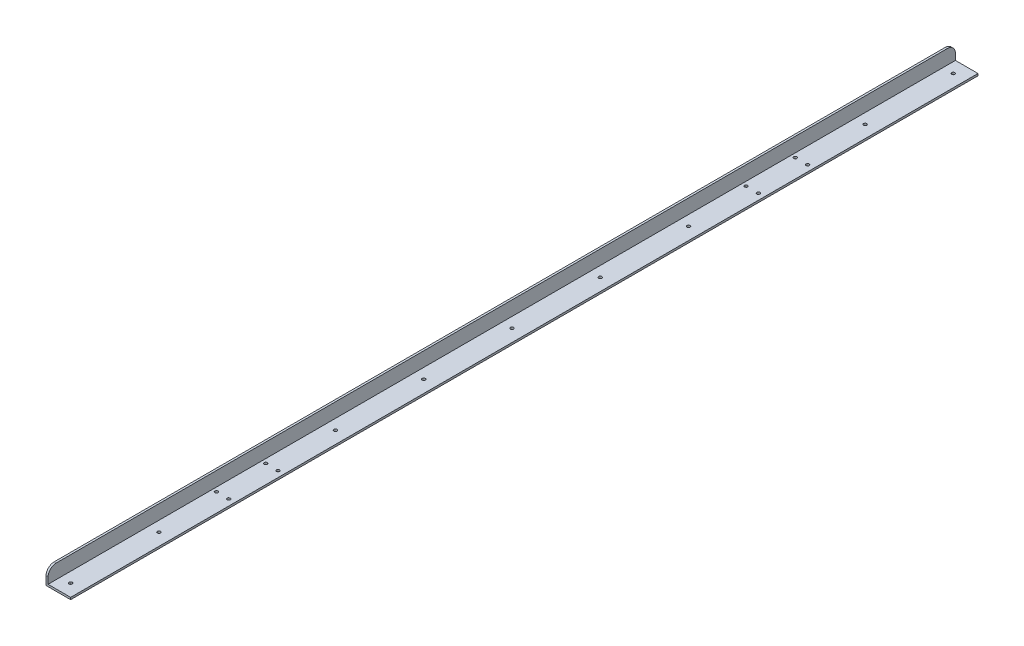
ISO-10303-21;
HEADER;
FILE_DESCRIPTION(('STEP AP214'),'2;1');
FILE_NAME('part.step','',(''),(''),'','','');
FILE_SCHEMA(('AUTOMOTIVE_DESIGN { 1 0 10303 214 1 1 1 1 }'));
ENDSEC;
DATA;
#1=APPLICATION_CONTEXT('core data for automotive mechanical design processes');
#2=APPLICATION_PROTOCOL_DEFINITION('international standard','automotive_design',2000,#1);
#3=PRODUCT_CONTEXT('',#1,'mechanical');
#4=PRODUCT('Part','Part','',(#3));
#5=PRODUCT_RELATED_PRODUCT_CATEGORY('part','',(#4));
#6=PRODUCT_DEFINITION_FORMATION('','',#4);
#7=PRODUCT_DEFINITION_CONTEXT('part definition',#1,'design');
#8=PRODUCT_DEFINITION('design','',#6,#7);
#9=PRODUCT_DEFINITION_SHAPE('','',#8);
#10=(LENGTH_UNIT() NAMED_UNIT(*) SI_UNIT(.MILLI.,.METRE.));
#11=(NAMED_UNIT(*) PLANE_ANGLE_UNIT() SI_UNIT($,.RADIAN.));
#12=(NAMED_UNIT(*) SI_UNIT($,.STERADIAN.) SOLID_ANGLE_UNIT());
#13=UNCERTAINTY_MEASURE_WITH_UNIT(LENGTH_MEASURE(1.E-05),#10,'distance_accuracy_value','');
#14=(GEOMETRIC_REPRESENTATION_CONTEXT(3) GLOBAL_UNCERTAINTY_ASSIGNED_CONTEXT((#13)) GLOBAL_UNIT_ASSIGNED_CONTEXT((#10,
#11,#12)) REPRESENTATION_CONTEXT('',''));
#15=CARTESIAN_POINT('',(0.,0.,0.));
#16=DIRECTION('',(0.,0.,1.));
#17=DIRECTION('',(1.,0.,0.));
#18=AXIS2_PLACEMENT_3D('',#15,#16,#17);
#19=CARTESIAN_POINT('',(38.1000000000001,3.17499999999998,-1403.35));
#20=DIRECTION('',(0.,1.,0.));
#21=DIRECTION('',(-1.,0.,0.));
#22=AXIS2_PLACEMENT_3D('',#19,#20,#21);
#23=PLANE('',#22);
#24=CARTESIAN_POINT('',(28.575,3.17499999999996,-1149.35));
#25=DIRECTION('',(0.,1.,0.));
#26=DIRECTION('',(-1.,0.,0.));
#27=AXIS2_PLACEMENT_3D('',#24,#25,#26);
#28=CIRCLE('',#27,2.38760000000015);
#29=CARTESIAN_POINT('',(26.1873999999999,3.17499999999996,-1149.35));
#30=VERTEX_POINT('',#29);
#31=EDGE_CURVE('E223',#30,#30,#28,.F.);
#32=ORIENTED_EDGE('',*,*,#31,.T.);
#33=EDGE_LOOP('',(#32));
#34=FACE_BOUND('',#33,.T.);
#35=CARTESIAN_POINT('',(28.575,3.175,-330.2));
#36=DIRECTION('',(0.,1.,0.));
#37=DIRECTION('',(-1.,0.,0.));
#38=AXIS2_PLACEMENT_3D('',#35,#36,#37);
#39=CIRCLE('',#38,2.38760000000001);
#40=CARTESIAN_POINT('',(26.1874,3.175,-330.2));
#41=VERTEX_POINT('',#40);
#42=EDGE_CURVE('E237',#41,#41,#39,.F.);
#43=ORIENTED_EDGE('',*,*,#42,.T.);
#44=EDGE_LOOP('',(#43));
#45=FACE_BOUND('',#44,.T.);
#46=CARTESIAN_POINT('',(19.0499999999999,3.17499999999998,-1247.775));
#47=DIRECTION('',(0.,1.,0.));
#48=DIRECTION('',(-1.,0.,0.));
#49=AXIS2_PLACEMENT_3D('',#46,#47,#48);
#50=CIRCLE('',#49,2.42570000000022);
#51=CARTESIAN_POINT('',(16.6242999999997,3.17499999999998,-1247.775));
#52=VERTEX_POINT('',#51);
#53=EDGE_CURVE('E247',#52,#52,#50,.F.);
#54=ORIENTED_EDGE('',*,*,#53,.T.);
#55=EDGE_LOOP('',(#54));
#56=FACE_BOUND('',#55,.T.);
#57=CARTESIAN_POINT('',(19.0500000000001,3.17500000000001,-838.2));
#58=DIRECTION('',(0.,1.,0.));
#59=DIRECTION('',(-1.,0.,0.));
#60=AXIS2_PLACEMENT_3D('',#57,#58,#59);
#61=CIRCLE('',#60,2.42569999999997);
#62=CARTESIAN_POINT('',(16.6243000000002,3.17500000000001,-838.2));
#63=VERTEX_POINT('',#62);
#64=EDGE_CURVE('E257',#63,#63,#61,.F.);
#65=ORIENTED_EDGE('',*,*,#64,.T.);
#66=EDGE_LOOP('',(#65));
#67=FACE_BOUND('',#66,.T.);
#68=CARTESIAN_POINT('',(19.05,3.175,-565.15));
#69=DIRECTION('',(0.,1.,0.));
#70=DIRECTION('',(-1.,0.,0.));
#71=AXIS2_PLACEMENT_3D('',#68,#69,#70);
#72=CIRCLE('',#71,2.42569999999997);
#73=CARTESIAN_POINT('',(16.6243,3.175,-565.15));
#74=VERTEX_POINT('',#73);
#75=EDGE_CURVE('E267',#74,#74,#72,.F.);
#76=ORIENTED_EDGE('',*,*,#75,.T.);
#77=EDGE_LOOP('',(#76));
#78=FACE_BOUND('',#77,.T.);
#79=CARTESIAN_POINT('',(19.05,3.175,-155.575));
#80=DIRECTION('',(0.,1.,0.));
#81=DIRECTION('',(-1.,0.,0.));
#82=AXIS2_PLACEMENT_3D('',#79,#80,#81);
#83=CIRCLE('',#82,2.42570000000002);
#84=CARTESIAN_POINT('',(16.6243,3.175,-155.575));
#85=VERTEX_POINT('',#84);
#86=EDGE_CURVE('E277',#85,#85,#83,.F.);
#87=ORIENTED_EDGE('',*,*,#86,.T.);
#88=EDGE_LOOP('',(#87));
#89=FACE_BOUND('',#88,.T.);
#90=CARTESIAN_POINT('',(28.575,3.17499999999993,-1073.15));
#91=DIRECTION('',(0.,1.,0.));
#92=DIRECTION('',(-1.,0.,0.));
#93=AXIS2_PLACEMENT_3D('',#90,#91,#92);
#94=CIRCLE('',#93,2.38760000000019);
#95=CARTESIAN_POINT('',(26.1873999999998,3.17499999999993,-1073.15));
#96=VERTEX_POINT('',#95);
#97=EDGE_CURVE('E287',#96,#96,#94,.F.);
#98=ORIENTED_EDGE('',*,*,#97,.T.);
#99=EDGE_LOOP('',(#98));
#100=FACE_BOUND('',#99,.T.);
#101=CARTESIAN_POINT('',(28.575,3.175,-254.));
#102=DIRECTION('',(0.,1.,0.));
#103=DIRECTION('',(-1.,0.,0.));
#104=AXIS2_PLACEMENT_3D('',#101,#102,#103);
#105=CIRCLE('',#104,2.38760000000001);
#106=CARTESIAN_POINT('',(26.1874,3.175,-254.));
#107=VERTEX_POINT('',#106);
#108=EDGE_CURVE('E297',#107,#107,#105,.F.);
#109=ORIENTED_EDGE('',*,*,#108,.T.);
#110=EDGE_LOOP('',(#109));
#111=FACE_BOUND('',#110,.T.);
#112=DIRECTION('',(-1.,0.,0.));
#113=VECTOR('',#112,1.);
#114=CARTESIAN_POINT('',(38.1000000000001,3.175,0.));
#115=LINE('',#114,#113);
#116=CARTESIAN_POINT('',(38.1000000000001,3.175,0.));
#117=VERTEX_POINT('',#116);
#118=CARTESIAN_POINT('',(3.17499999999993,3.17500000000001,0.));
#119=VERTEX_POINT('',#118);
#120=EDGE_CURVE('E126',#117,#119,#115,.T.);
#121=ORIENTED_EDGE('',*,*,#120,.F.);
#122=DIRECTION('',(0.,0.,1.));
#123=VECTOR('',#122,1.);
#124=CARTESIAN_POINT('',(38.1000000000001,3.17499999999998,-1403.35));
#125=LINE('',#124,#123);
#126=CARTESIAN_POINT('',(38.1000000000001,3.17499999999998,-1403.35));
#127=VERTEX_POINT('',#126);
#128=EDGE_CURVE('E152',#127,#117,#125,.T.);
#129=ORIENTED_EDGE('',*,*,#128,.F.);
#130=DIRECTION('',(-1.,0.,0.));
#131=VECTOR('',#130,1.);
#132=CARTESIAN_POINT('',(38.1000000000001,3.17499999999998,-1403.35));
#133=LINE('',#132,#131);
#134=CARTESIAN_POINT('',(3.17500000000004,3.17500000000004,-1403.35));
#135=VERTEX_POINT('',#134);
#136=EDGE_CURVE('E140',#127,#135,#133,.T.);
#137=ORIENTED_EDGE('',*,*,#136,.T.);
#138=DIRECTION('',(0.,0.,1.));
#139=VECTOR('',#138,1.);
#140=CARTESIAN_POINT('',(3.17500000000004,3.17500000000004,-1403.35));
#141=LINE('',#140,#139);
#142=EDGE_CURVE('E150',#135,#119,#141,.T.);
#143=ORIENTED_EDGE('',*,*,#142,.T.);
#144=EDGE_LOOP('',(#121,#129,#137,#143));
#145=FACE_BOUND('',#144,.T.);
#146=CARTESIAN_POINT('',(9.52500000000001,3.17500000000001,-254.));
#147=DIRECTION('',(0.,1.,0.));
#148=DIRECTION('',(-1.,0.,0.));
#149=AXIS2_PLACEMENT_3D('',#146,#147,#148);
#150=CIRCLE('',#149,2.38760000000003);
#151=CARTESIAN_POINT('',(7.13739999999998,3.17500000000001,-254.));
#152=VERTEX_POINT('',#151);
#153=EDGE_CURVE('E109',#152,#152,#150,.F.);
#154=ORIENTED_EDGE('',*,*,#153,.T.);
#155=EDGE_LOOP('',(#154));
#156=FACE_BOUND('',#155,.T.);
#157=CARTESIAN_POINT('',(9.52500000000001,3.17499999999993,-1073.15));
#158=DIRECTION('',(0.,1.,0.));
#159=DIRECTION('',(-1.,0.,0.));
#160=AXIS2_PLACEMENT_3D('',#157,#158,#159);
#161=CIRCLE('',#160,2.38760000000019);
#162=CARTESIAN_POINT('',(7.13739999999981,3.17499999999993,-1073.15));
#163=VERTEX_POINT('',#162);
#164=EDGE_CURVE('E190',#163,#163,#161,.F.);
#165=ORIENTED_EDGE('',*,*,#164,.T.);
#166=EDGE_LOOP('',(#165));
#167=FACE_BOUND('',#166,.T.);
#168=CARTESIAN_POINT('',(19.0499999999999,3.175,-19.05));
#169=DIRECTION('',(0.,1.,0.));
#170=DIRECTION('',(-1.,0.,0.));
#171=AXIS2_PLACEMENT_3D('',#168,#169,#170);
#172=CIRCLE('',#171,2.4257);
#173=CARTESIAN_POINT('',(16.6242999999999,3.175,-19.05));
#174=VERTEX_POINT('',#173);
#175=EDGE_CURVE('E194',#174,#174,#172,.F.);
#176=ORIENTED_EDGE('',*,*,#175,.T.);
#177=EDGE_LOOP('',(#176));
#178=FACE_BOUND('',#177,.T.);
#179=CARTESIAN_POINT('',(19.05,3.17499999999998,-428.625));
#180=DIRECTION('',(0.,1.,0.));
#181=DIRECTION('',(-1.,0.,0.));
#182=AXIS2_PLACEMENT_3D('',#179,#180,#181);
#183=CIRCLE('',#182,2.42569999999997);
#184=CARTESIAN_POINT('',(16.6243,3.17499999999998,-428.625));
#185=VERTEX_POINT('',#184);
#186=EDGE_CURVE('E198',#185,#185,#183,.F.);
#187=ORIENTED_EDGE('',*,*,#186,.T.);
#188=EDGE_LOOP('',(#187));
#189=FACE_BOUND('',#188,.T.);
#190=CARTESIAN_POINT('',(19.05,3.17500000000003,-701.675));
#191=DIRECTION('',(0.,1.,0.));
#192=DIRECTION('',(-1.,0.,0.));
#193=AXIS2_PLACEMENT_3D('',#190,#191,#192);
#194=CIRCLE('',#193,2.42569999999997);
#195=CARTESIAN_POINT('',(16.6243,3.17500000000002,-701.675));
#196=VERTEX_POINT('',#195);
#197=EDGE_CURVE('E202',#196,#196,#194,.F.);
#198=ORIENTED_EDGE('',*,*,#197,.T.);
#199=EDGE_LOOP('',(#198));
#200=FACE_BOUND('',#199,.T.);
#201=CARTESIAN_POINT('',(19.0500000000001,3.17500000000001,-974.725));
#202=DIRECTION('',(0.,1.,0.));
#203=DIRECTION('',(-1.,0.,0.));
#204=AXIS2_PLACEMENT_3D('',#201,#202,#203);
#205=CIRCLE('',#204,2.42569999999997);
#206=CARTESIAN_POINT('',(16.6243000000002,3.17500000000001,-974.725));
#207=VERTEX_POINT('',#206);
#208=EDGE_CURVE('E206',#207,#207,#205,.F.);
#209=ORIENTED_EDGE('',*,*,#208,.T.);
#210=EDGE_LOOP('',(#209));
#211=FACE_BOUND('',#210,.T.);
#212=CARTESIAN_POINT('',(19.05,3.17499999999996,-1384.3));
#213=DIRECTION('',(0.,1.,0.));
#214=DIRECTION('',(-1.,0.,0.));
#215=AXIS2_PLACEMENT_3D('',#212,#213,#214);
#216=CIRCLE('',#215,2.42570000000022);
#217=CARTESIAN_POINT('',(16.6242999999998,3.17499999999996,-1384.3));
#218=VERTEX_POINT('',#217);
#219=EDGE_CURVE('E210',#218,#218,#216,.F.);
#220=ORIENTED_EDGE('',*,*,#219,.T.);
#221=EDGE_LOOP('',(#220));
#222=FACE_BOUND('',#221,.T.);
#223=CARTESIAN_POINT('',(9.52500000000001,3.17499999999998,-330.2));
#224=DIRECTION('',(0.,1.,0.));
#225=DIRECTION('',(-1.,0.,0.));
#226=AXIS2_PLACEMENT_3D('',#223,#224,#225);
#227=CIRCLE('',#226,2.38760000000003);
#228=CARTESIAN_POINT('',(7.13739999999997,3.17499999999998,-330.2));
#229=VERTEX_POINT('',#228);
#230=EDGE_CURVE('E214',#229,#229,#227,.F.);
#231=ORIENTED_EDGE('',*,*,#230,.T.);
#232=EDGE_LOOP('',(#231));
#233=FACE_BOUND('',#232,.T.);
#234=CARTESIAN_POINT('',(9.52500000000001,3.17499999999996,-1149.35));
#235=DIRECTION('',(0.,1.,0.));
#236=DIRECTION('',(-1.,0.,0.));
#237=AXIS2_PLACEMENT_3D('',#234,#235,#236);
#238=CIRCLE('',#237,2.38760000000015);
#239=CARTESIAN_POINT('',(7.13739999999986,3.17499999999996,-1149.35));
#240=VERTEX_POINT('',#239);
#241=EDGE_CURVE('E217',#240,#240,#238,.F.);
#242=ORIENTED_EDGE('',*,*,#241,.T.);
#243=EDGE_LOOP('',(#242));
#244=FACE_BOUND('',#243,.T.);
#245=ADVANCED_FACE('F32',(#34,#45,#56,#67,#78,#89,#100,#111,#145,#156,#167,#178,#189,#200,#211,
#222,#233,#244),#23,.T.);
#246=CARTESIAN_POINT('',(0.,0.,-1403.35));
#247=DIRECTION('',(0.,-1.,0.));
#248=DIRECTION('',(0.,0.,-1.));
#249=AXIS2_PLACEMENT_3D('',#246,#247,#248);
#250=PLANE('',#249);
#251=CARTESIAN_POINT('',(28.5750000000001,0.,-1149.35));
#252=DIRECTION('',(0.,1.,0.));
#253=DIRECTION('',(0.,0.,1.));
#254=AXIS2_PLACEMENT_3D('',#251,#252,#253);
#255=CIRCLE('',#254,2.38760000000015);
#256=CARTESIAN_POINT('',(28.5750000000001,0.,-1146.9624));
#257=VERTEX_POINT('',#256);
#258=EDGE_CURVE('E219',#257,#257,#255,.T.);
#259=ORIENTED_EDGE('',*,*,#258,.T.);
#260=EDGE_LOOP('',(#259));
#261=FACE_BOUND('',#260,.T.);
#262=CARTESIAN_POINT('',(28.575,0.,-330.2));
#263=DIRECTION('',(0.,1.,0.));
#264=DIRECTION('',(0.,0.,1.));
#265=AXIS2_PLACEMENT_3D('',#262,#263,#264);
#266=CIRCLE('',#265,2.38760000000001);
#267=CARTESIAN_POINT('',(28.575,0.,-327.8124));
#268=VERTEX_POINT('',#267);
#269=EDGE_CURVE('E234',#268,#268,#266,.T.);
#270=ORIENTED_EDGE('',*,*,#269,.T.);
#271=EDGE_LOOP('',(#270));
#272=FACE_BOUND('',#271,.T.);
#273=CARTESIAN_POINT('',(19.05,0.,-1247.775));
#274=DIRECTION('',(0.,1.,0.));
#275=DIRECTION('',(0.,0.,1.));
#276=AXIS2_PLACEMENT_3D('',#273,#274,#275);
#277=CIRCLE('',#276,2.42570000000022);
#278=CARTESIAN_POINT('',(19.05,0.,-1245.3493));
#279=VERTEX_POINT('',#278);
#280=EDGE_CURVE('E244',#279,#279,#277,.T.);
#281=ORIENTED_EDGE('',*,*,#280,.T.);
#282=EDGE_LOOP('',(#281));
#283=FACE_BOUND('',#282,.T.);
#284=CARTESIAN_POINT('',(19.0500000000001,0.,-838.2));
#285=DIRECTION('',(0.,1.,0.));
#286=DIRECTION('',(0.,0.,1.));
#287=AXIS2_PLACEMENT_3D('',#284,#285,#286);
#288=CIRCLE('',#287,2.42569999999997);
#289=CARTESIAN_POINT('',(19.0500000000001,0.,-835.7743));
#290=VERTEX_POINT('',#289);
#291=EDGE_CURVE('E254',#290,#290,#288,.T.);
#292=ORIENTED_EDGE('',*,*,#291,.T.);
#293=EDGE_LOOP('',(#292));
#294=FACE_BOUND('',#293,.T.);
#295=CARTESIAN_POINT('',(19.05,0.,-565.15));
#296=DIRECTION('',(0.,1.,0.));
#297=DIRECTION('',(0.,0.,1.));
#298=AXIS2_PLACEMENT_3D('',#295,#296,#297);
#299=CIRCLE('',#298,2.42569999999997);
#300=CARTESIAN_POINT('',(19.05,0.,-562.7243));
#301=VERTEX_POINT('',#300);
#302=EDGE_CURVE('E264',#301,#301,#299,.T.);
#303=ORIENTED_EDGE('',*,*,#302,.T.);
#304=EDGE_LOOP('',(#303));
#305=FACE_BOUND('',#304,.T.);
#306=CARTESIAN_POINT('',(19.05,0.,-155.575));
#307=DIRECTION('',(0.,1.,0.));
#308=DIRECTION('',(0.,0.,1.));
#309=AXIS2_PLACEMENT_3D('',#306,#307,#308);
#310=CIRCLE('',#309,2.42570000000002);
#311=CARTESIAN_POINT('',(19.05,0.,-153.1493));
#312=VERTEX_POINT('',#311);
#313=EDGE_CURVE('E274',#312,#312,#310,.T.);
#314=ORIENTED_EDGE('',*,*,#313,.T.);
#315=EDGE_LOOP('',(#314));
#316=FACE_BOUND('',#315,.T.);
#317=CARTESIAN_POINT('',(28.5750000000001,0.,-1073.15));
#318=DIRECTION('',(0.,1.,0.));
#319=DIRECTION('',(0.,0.,1.));
#320=AXIS2_PLACEMENT_3D('',#317,#318,#319);
#321=CIRCLE('',#320,2.38760000000019);
#322=CARTESIAN_POINT('',(28.5750000000001,0.,-1070.7624));
#323=VERTEX_POINT('',#322);
#324=EDGE_CURVE('E284',#323,#323,#321,.T.);
#325=ORIENTED_EDGE('',*,*,#324,.T.);
#326=EDGE_LOOP('',(#325));
#327=FACE_BOUND('',#326,.T.);
#328=CARTESIAN_POINT('',(28.5749999999999,0.,-254.));
#329=DIRECTION('',(0.,1.,0.));
#330=DIRECTION('',(0.,0.,1.));
#331=AXIS2_PLACEMENT_3D('',#328,#329,#330);
#332=CIRCLE('',#331,2.38760000000001);
#333=CARTESIAN_POINT('',(28.5749999999999,0.,-251.6124));
#334=VERTEX_POINT('',#333);
#335=EDGE_CURVE('E294',#334,#334,#332,.T.);
#336=ORIENTED_EDGE('',*,*,#335,.T.);
#337=EDGE_LOOP('',(#336));
#338=FACE_BOUND('',#337,.T.);
#339=DIRECTION('',(1.,0.,0.));
#340=VECTOR('',#339,1.);
#341=CARTESIAN_POINT('',(0.,0.,0.));
#342=LINE('',#341,#340);
#343=CARTESIAN_POINT('',(0.,0.,0.));
#344=VERTEX_POINT('',#343);
#345=CARTESIAN_POINT('',(38.1,0.,0.));
#346=VERTEX_POINT('',#345);
#347=EDGE_CURVE('E106',#344,#346,#342,.T.);
#348=ORIENTED_EDGE('',*,*,#347,.F.);
#349=DIRECTION('',(0.,0.,1.));
#350=VECTOR('',#349,1.);
#351=CARTESIAN_POINT('',(0.,0.,-1403.35));
#352=LINE('',#351,#350);
#353=CARTESIAN_POINT('',(0.,0.,-1403.35));
#354=VERTEX_POINT('',#353);
#355=EDGE_CURVE('E112',#354,#344,#352,.T.);
#356=ORIENTED_EDGE('',*,*,#355,.F.);
#357=DIRECTION('',(1.,0.,0.));
#358=VECTOR('',#357,1.);
#359=CARTESIAN_POINT('',(0.,0.,-1403.35));
#360=LINE('',#359,#358);
#361=CARTESIAN_POINT('',(38.1,0.,-1403.35));
#362=VERTEX_POINT('',#361);
#363=EDGE_CURVE('E135',#354,#362,#360,.T.);
#364=ORIENTED_EDGE('',*,*,#363,.T.);
#365=DIRECTION('',(0.,0.,1.));
#366=VECTOR('',#365,1.);
#367=CARTESIAN_POINT('',(38.1,0.,-1403.35));
#368=LINE('',#367,#366);
#369=EDGE_CURVE('E118',#362,#346,#368,.T.);
#370=ORIENTED_EDGE('',*,*,#369,.T.);
#371=EDGE_LOOP('',(#348,#356,#364,#370));
#372=FACE_BOUND('',#371,.T.);
#373=CARTESIAN_POINT('',(9.52500000000012,0.,-254.));
#374=DIRECTION('',(0.,1.,0.));
#375=DIRECTION('',(0.,0.,1.));
#376=AXIS2_PLACEMENT_3D('',#373,#374,#375);
#377=CIRCLE('',#376,2.38760000000003);
#378=CARTESIAN_POINT('',(9.52500000000012,0.,-251.6124));
#379=VERTEX_POINT('',#378);
#380=EDGE_CURVE('E300',#379,#379,#377,.T.);
#381=ORIENTED_EDGE('',*,*,#380,.T.);
#382=EDGE_LOOP('',(#381));
#383=FACE_BOUND('',#382,.T.);
#384=CARTESIAN_POINT('',(9.52500000000001,0.,-1073.15));
#385=DIRECTION('',(0.,1.,0.));
#386=DIRECTION('',(0.,0.,1.));
#387=AXIS2_PLACEMENT_3D('',#384,#385,#386);
#388=CIRCLE('',#387,2.38760000000019);
#389=CARTESIAN_POINT('',(9.52500000000001,0.,-1070.7624));
#390=VERTEX_POINT('',#389);
#391=EDGE_CURVE('E290',#390,#390,#388,.T.);
#392=ORIENTED_EDGE('',*,*,#391,.T.);
#393=EDGE_LOOP('',(#392));
#394=FACE_BOUND('',#393,.T.);
#395=CARTESIAN_POINT('',(19.05,0.,-19.05));
#396=DIRECTION('',(0.,1.,0.));
#397=DIRECTION('',(0.,0.,1.));
#398=AXIS2_PLACEMENT_3D('',#395,#396,#397);
#399=CIRCLE('',#398,2.4257);
#400=CARTESIAN_POINT('',(19.05,0.,-16.6243));
#401=VERTEX_POINT('',#400);
#402=EDGE_CURVE('E280',#401,#401,#399,.T.);
#403=ORIENTED_EDGE('',*,*,#402,.T.);
#404=EDGE_LOOP('',(#403));
#405=FACE_BOUND('',#404,.T.);
#406=CARTESIAN_POINT('',(19.05,0.,-428.625));
#407=DIRECTION('',(0.,1.,0.));
#408=DIRECTION('',(0.,0.,1.));
#409=AXIS2_PLACEMENT_3D('',#406,#407,#408);
#410=CIRCLE('',#409,2.42569999999997);
#411=CARTESIAN_POINT('',(19.05,0.,-426.1993));
#412=VERTEX_POINT('',#411);
#413=EDGE_CURVE('E270',#412,#412,#410,.T.);
#414=ORIENTED_EDGE('',*,*,#413,.T.);
#415=EDGE_LOOP('',(#414));
#416=FACE_BOUND('',#415,.T.);
#417=CARTESIAN_POINT('',(19.0500000000001,0.,-701.675));
#418=DIRECTION('',(0.,1.,0.));
#419=DIRECTION('',(0.,0.,1.));
#420=AXIS2_PLACEMENT_3D('',#417,#418,#419);
#421=CIRCLE('',#420,2.42569999999997);
#422=CARTESIAN_POINT('',(19.0500000000001,0.,-699.2493));
#423=VERTEX_POINT('',#422);
#424=EDGE_CURVE('E260',#423,#423,#421,.T.);
#425=ORIENTED_EDGE('',*,*,#424,.T.);
#426=EDGE_LOOP('',(#425));
#427=FACE_BOUND('',#426,.T.);
#428=CARTESIAN_POINT('',(19.05,0.,-974.725));
#429=DIRECTION('',(0.,1.,0.));
#430=DIRECTION('',(0.,0.,1.));
#431=AXIS2_PLACEMENT_3D('',#428,#429,#430);
#432=CIRCLE('',#431,2.42569999999997);
#433=CARTESIAN_POINT('',(19.05,0.,-972.2993));
#434=VERTEX_POINT('',#433);
#435=EDGE_CURVE('E250',#434,#434,#432,.T.);
#436=ORIENTED_EDGE('',*,*,#435,.T.);
#437=EDGE_LOOP('',(#436));
#438=FACE_BOUND('',#437,.T.);
#439=CARTESIAN_POINT('',(19.0500000000001,0.,-1384.3));
#440=DIRECTION('',(0.,1.,0.));
#441=DIRECTION('',(0.,0.,1.));
#442=AXIS2_PLACEMENT_3D('',#439,#440,#441);
#443=CIRCLE('',#442,2.42570000000022);
#444=CARTESIAN_POINT('',(19.0500000000001,0.,-1381.8743));
#445=VERTEX_POINT('',#444);
#446=EDGE_CURVE('E240',#445,#445,#443,.T.);
#447=ORIENTED_EDGE('',*,*,#446,.T.);
#448=EDGE_LOOP('',(#447));
#449=FACE_BOUND('',#448,.T.);
#450=CARTESIAN_POINT('',(9.5249999999999,0.,-330.2));
#451=DIRECTION('',(0.,1.,0.));
#452=DIRECTION('',(0.,0.,1.));
#453=AXIS2_PLACEMENT_3D('',#450,#451,#452);
#454=CIRCLE('',#453,2.38760000000003);
#455=CARTESIAN_POINT('',(9.5249999999999,0.,-327.8124));
#456=VERTEX_POINT('',#455);
#457=EDGE_CURVE('E230',#456,#456,#454,.T.);
#458=ORIENTED_EDGE('',*,*,#457,.T.);
#459=EDGE_LOOP('',(#458));
#460=FACE_BOUND('',#459,.T.);
#461=CARTESIAN_POINT('',(9.5249999999999,0.,-1149.35));
#462=DIRECTION('',(0.,1.,0.));
#463=DIRECTION('',(0.,0.,1.));
#464=AXIS2_PLACEMENT_3D('',#461,#462,#463);
#465=CIRCLE('',#464,2.38760000000015);
#466=CARTESIAN_POINT('',(9.5249999999999,0.,-1146.9624));
#467=VERTEX_POINT('',#466);
#468=EDGE_CURVE('E220',#467,#467,#465,.T.);
#469=ORIENTED_EDGE('',*,*,#468,.T.);
#470=EDGE_LOOP('',(#469));
#471=FACE_BOUND('',#470,.T.);
#472=ADVANCED_FACE('F121',(#261,#272,#283,#294,#305,#316,#327,#338,#372,#383,#394,#405,#416,
#427,#438,#449,#460,#471),#250,.T.);
#473=CARTESIAN_POINT('',(1.11022302462516E-13,25.4,-1403.35));
#474=DIRECTION('',(-1.,0.,0.));
#475=DIRECTION('',(0.,-1.,0.));
#476=AXIS2_PLACEMENT_3D('',#473,#474,#475);
#477=PLANE('',#476);
#478=DIRECTION('',(0.,0.,1.));
#479=VECTOR('',#478,1.);
#480=CARTESIAN_POINT('',(1.11022302462516E-13,25.4,-1403.35));
#481=LINE('',#480,#479);
#482=CARTESIAN_POINT('',(1.11022302462516E-13,25.4,-1390.65));
#483=VERTEX_POINT('',#482);
#484=CARTESIAN_POINT('',(0.,25.4,-12.6999999999999));
#485=VERTEX_POINT('',#484);
#486=EDGE_CURVE('E144',#483,#485,#481,.T.);
#487=ORIENTED_EDGE('',*,*,#486,.F.);
#488=CARTESIAN_POINT('',(1.11022302462516E-13,12.7,-1390.65));
#489=DIRECTION('',(-1.,0.,0.));
#490=DIRECTION('',(0.,-1.,0.));
#491=AXIS2_PLACEMENT_3D('',#488,#489,#490);
#492=CIRCLE('',#491,12.7);
#493=CARTESIAN_POINT('',(-1.11022302462516E-13,12.7,-1403.35));
#494=VERTEX_POINT('',#493);
#495=EDGE_CURVE('E161',#483,#494,#492,.T.);
#496=ORIENTED_EDGE('',*,*,#495,.T.);
#497=DIRECTION('',(0.,-1.,0.));
#498=VECTOR('',#497,1.);
#499=CARTESIAN_POINT('',(1.11022302462516E-13,25.4,-1403.35));
#500=LINE('',#499,#498);
#501=EDGE_CURVE('E114',#494,#354,#500,.T.);
#502=ORIENTED_EDGE('',*,*,#501,.T.);
#503=ORIENTED_EDGE('',*,*,#355,.T.);
#504=DIRECTION('',(0.,-1.,0.));
#505=VECTOR('',#504,1.);
#506=CARTESIAN_POINT('',(0.,25.4,1.11022302462516E-13));
#507=LINE('',#506,#505);
#508=CARTESIAN_POINT('',(0.,12.7,0.));
#509=VERTEX_POINT('',#508);
#510=EDGE_CURVE('E101',#509,#344,#507,.T.);
#511=ORIENTED_EDGE('',*,*,#510,.F.);
#512=CARTESIAN_POINT('',(0.,12.7,-12.6999999999999));
#513=DIRECTION('',(-1.,0.,0.));
#514=DIRECTION('',(0.,-1.,0.));
#515=AXIS2_PLACEMENT_3D('',#512,#513,#514);
#516=CIRCLE('',#515,12.7);
#517=EDGE_CURVE('E159',#509,#485,#516,.T.);
#518=ORIENTED_EDGE('',*,*,#517,.T.);
#519=EDGE_LOOP('',(#487,#496,#502,#503,#511,#518));
#520=FACE_BOUND('',#519,.T.);
#521=ADVANCED_FACE('F34',(#520),#477,.T.);
#522=CARTESIAN_POINT('',(3.17500000000004,25.4000000000001,-1403.35));
#523=DIRECTION('',(0.,1.,0.));
#524=DIRECTION('',(0.,0.,1.));
#525=AXIS2_PLACEMENT_3D('',#522,#523,#524);
#526=PLANE('',#525);
#527=DIRECTION('',(0.,0.,1.));
#528=VECTOR('',#527,1.);
#529=CARTESIAN_POINT('',(3.17500000000004,25.4000000000001,-1403.35));
#530=LINE('',#529,#528);
#531=CARTESIAN_POINT('',(3.17500000000004,25.4,-1390.65));
#532=VERTEX_POINT('',#531);
#533=CARTESIAN_POINT('',(3.17500000000004,25.4,-12.6999999999999));
#534=VERTEX_POINT('',#533);
#535=EDGE_CURVE('E148',#532,#534,#530,.T.);
#536=ORIENTED_EDGE('',*,*,#535,.F.);
#537=DIRECTION('',(-1.,0.,0.));
#538=VECTOR('',#537,1.);
#539=CARTESIAN_POINT('',(1.11022302462516E-13,25.4,-1390.65));
#540=LINE('',#539,#538);
#541=EDGE_CURVE('E156',#532,#483,#540,.T.);
#542=ORIENTED_EDGE('',*,*,#541,.T.);
#543=ORIENTED_EDGE('',*,*,#486,.T.);
#544=DIRECTION('',(-1.,0.,0.));
#545=VECTOR('',#544,1.);
#546=CARTESIAN_POINT('',(3.17500000000004,25.4,-12.6999999999999));
#547=LINE('',#546,#545);
#548=EDGE_CURVE('E147',#485,#534,#547,.F.);
#549=ORIENTED_EDGE('',*,*,#548,.T.);
#550=EDGE_LOOP('',(#536,#542,#543,#549));
#551=FACE_BOUND('',#550,.T.);
#552=ADVANCED_FACE('F170',(#551),#526,.T.);
#553=CARTESIAN_POINT('',(3.17500000000004,3.17500000000004,-1403.35));
#554=DIRECTION('',(1.,0.,0.));
#555=DIRECTION('',(0.,1.,0.));
#556=AXIS2_PLACEMENT_3D('',#553,#554,#555);
#557=PLANE('',#556);
#558=DIRECTION('',(0.,1.,0.));
#559=VECTOR('',#558,1.);
#560=CARTESIAN_POINT('',(3.17500000000004,3.17500000000004,-1403.35));
#561=LINE('',#560,#559);
#562=CARTESIAN_POINT('',(3.17500000000004,12.7,-1403.35));
#563=VERTEX_POINT('',#562);
#564=EDGE_CURVE('E119',#135,#563,#561,.T.);
#565=ORIENTED_EDGE('',*,*,#564,.T.);
#566=CARTESIAN_POINT('',(3.17500000000004,12.7,-1390.65));
#567=DIRECTION('',(1.,0.,0.));
#568=DIRECTION('',(0.,1.,0.));
#569=AXIS2_PLACEMENT_3D('',#566,#567,#568);
#570=CIRCLE('',#569,12.7);
#571=EDGE_CURVE('E40',#563,#532,#570,.T.);
#572=ORIENTED_EDGE('',*,*,#571,.T.);
#573=ORIENTED_EDGE('',*,*,#535,.T.);
#574=CARTESIAN_POINT('',(3.17499999999993,12.7,-12.7));
#575=DIRECTION('',(1.,0.,0.));
#576=DIRECTION('',(0.,1.,0.));
#577=AXIS2_PLACEMENT_3D('',#574,#575,#576);
#578=CIRCLE('',#577,12.7);
#579=CARTESIAN_POINT('',(3.17499999999993,12.7,0.));
#580=VERTEX_POINT('',#579);
#581=EDGE_CURVE('E47',#534,#580,#578,.T.);
#582=ORIENTED_EDGE('',*,*,#581,.T.);
#583=DIRECTION('',(0.,1.,0.));
#584=VECTOR('',#583,1.);
#585=CARTESIAN_POINT('',(3.17499999999993,3.17500000000001,0.));
#586=LINE('',#585,#584);
#587=EDGE_CURVE('E132',#119,#580,#586,.T.);
#588=ORIENTED_EDGE('',*,*,#587,.F.);
#589=ORIENTED_EDGE('',*,*,#142,.F.);
#590=EDGE_LOOP('',(#565,#572,#573,#582,#588,#589));
#591=FACE_BOUND('',#590,.T.);
#592=ADVANCED_FACE('F166',(#591),#557,.T.);
#593=CARTESIAN_POINT('',(38.1,0.,-1403.35));
#594=DIRECTION('',(1.,0.,0.));
#595=DIRECTION('',(0.,0.,-1.));
#596=AXIS2_PLACEMENT_3D('',#593,#594,#595);
#597=PLANE('',#596);
#598=DIRECTION('',(0.,1.,0.));
#599=VECTOR('',#598,1.);
#600=CARTESIAN_POINT('',(38.1,0.,0.));
#601=LINE('',#600,#599);
#602=EDGE_CURVE('E124',#346,#117,#601,.T.);
#603=ORIENTED_EDGE('',*,*,#602,.F.);
#604=ORIENTED_EDGE('',*,*,#369,.F.);
#605=DIRECTION('',(0.,1.,0.));
#606=VECTOR('',#605,1.);
#607=CARTESIAN_POINT('',(38.1,0.,-1403.35));
#608=LINE('',#607,#606);
#609=EDGE_CURVE('E137',#362,#127,#608,.T.);
#610=ORIENTED_EDGE('',*,*,#609,.T.);
#611=ORIENTED_EDGE('',*,*,#128,.T.);
#612=EDGE_LOOP('',(#603,#604,#610,#611));
#613=FACE_BOUND('',#612,.T.);
#614=ADVANCED_FACE('F177',(#613),#597,.T.);
#615=CARTESIAN_POINT('',(0.,0.,-1403.35));
#616=DIRECTION('',(0.,0.,1.));
#617=DIRECTION('',(1.,0.,0.));
#618=AXIS2_PLACEMENT_3D('',#615,#616,#617);
#619=PLANE('',#618);
#620=ORIENTED_EDGE('',*,*,#501,.F.);
#621=DIRECTION('',(-1.,0.,0.));
#622=VECTOR('',#621,1.);
#623=CARTESIAN_POINT('',(3.17500000000004,12.7,-1403.35));
#624=LINE('',#623,#622);
#625=EDGE_CURVE('E55',#494,#563,#624,.F.);
#626=ORIENTED_EDGE('',*,*,#625,.T.);
#627=ORIENTED_EDGE('',*,*,#564,.F.);
#628=ORIENTED_EDGE('',*,*,#136,.F.);
#629=ORIENTED_EDGE('',*,*,#609,.F.);
#630=ORIENTED_EDGE('',*,*,#363,.F.);
#631=EDGE_LOOP('',(#620,#626,#627,#628,#629,#630));
#632=FACE_BOUND('',#631,.T.);
#633=ADVANCED_FACE('F173',(#632),#619,.F.);
#634=CARTESIAN_POINT('',(0.,0.,0.));
#635=DIRECTION('',(0.,0.,1.));
#636=DIRECTION('',(1.,0.,0.));
#637=AXIS2_PLACEMENT_3D('',#634,#635,#636);
#638=PLANE('',#637);
#639=ORIENTED_EDGE('',*,*,#587,.T.);
#640=DIRECTION('',(-1.,0.,0.));
#641=VECTOR('',#640,1.);
#642=CARTESIAN_POINT('',(0.,12.7,0.));
#643=LINE('',#642,#641);
#644=EDGE_CURVE('E11',#580,#509,#643,.T.);
#645=ORIENTED_EDGE('',*,*,#644,.T.);
#646=ORIENTED_EDGE('',*,*,#510,.T.);
#647=ORIENTED_EDGE('',*,*,#347,.T.);
#648=ORIENTED_EDGE('',*,*,#602,.T.);
#649=ORIENTED_EDGE('',*,*,#120,.T.);
#650=EDGE_LOOP('',(#639,#645,#646,#647,#648,#649));
#651=FACE_BOUND('',#650,.T.);
#652=ADVANCED_FACE('F103',(#651),#638,.T.);
#653=CARTESIAN_POINT('',(9.52500000000012,25.4,-254.));
#654=DIRECTION('',(0.,-1.,0.));
#655=DIRECTION('',(0.,0.,-1.));
#656=AXIS2_PLACEMENT_3D('',#653,#654,#655);
#657=CYLINDRICAL_SURFACE('',#656,2.38760000000003);
#658=ORIENTED_EDGE('',*,*,#153,.F.);
#659=EDGE_LOOP('',(#658));
#660=FACE_BOUND('',#659,.T.);
#661=ORIENTED_EDGE('',*,*,#380,.F.);
#662=EDGE_LOOP('',(#661));
#663=FACE_BOUND('',#662,.T.);
#664=ADVANCED_FACE('F305',(#660,#663),#657,.F.);
#665=CARTESIAN_POINT('',(28.575,25.4,-254.));
#666=DIRECTION('',(0.,-1.,0.));
#667=DIRECTION('',(0.,0.,-1.));
#668=AXIS2_PLACEMENT_3D('',#665,#666,#667);
#669=CYLINDRICAL_SURFACE('',#668,2.38760000000001);
#670=ORIENTED_EDGE('',*,*,#108,.F.);
#671=EDGE_LOOP('',(#670));
#672=FACE_BOUND('',#671,.T.);
#673=ORIENTED_EDGE('',*,*,#335,.F.);
#674=EDGE_LOOP('',(#673));
#675=FACE_BOUND('',#674,.T.);
#676=ADVANCED_FACE('F307',(#672,#675),#669,.F.);
#677=CARTESIAN_POINT('',(9.52500000000001,25.4,-1073.15));
#678=DIRECTION('',(0.,-1.,0.));
#679=DIRECTION('',(0.,0.,-1.));
#680=AXIS2_PLACEMENT_3D('',#677,#678,#679);
#681=CYLINDRICAL_SURFACE('',#680,2.38760000000019);
#682=ORIENTED_EDGE('',*,*,#164,.F.);
#683=EDGE_LOOP('',(#682));
#684=FACE_BOUND('',#683,.T.);
#685=ORIENTED_EDGE('',*,*,#391,.F.);
#686=EDGE_LOOP('',(#685));
#687=FACE_BOUND('',#686,.T.);
#688=ADVANCED_FACE('F314',(#684,#687),#681,.F.);
#689=CARTESIAN_POINT('',(28.5750000000001,25.4,-1073.15));
#690=DIRECTION('',(0.,-1.,0.));
#691=DIRECTION('',(0.,0.,-1.));
#692=AXIS2_PLACEMENT_3D('',#689,#690,#691);
#693=CYLINDRICAL_SURFACE('',#692,2.38760000000019);
#694=ORIENTED_EDGE('',*,*,#97,.F.);
#695=EDGE_LOOP('',(#694));
#696=FACE_BOUND('',#695,.T.);
#697=ORIENTED_EDGE('',*,*,#324,.F.);
#698=EDGE_LOOP('',(#697));
#699=FACE_BOUND('',#698,.T.);
#700=ADVANCED_FACE('F349',(#696,#699),#693,.F.);
#701=CARTESIAN_POINT('',(19.05,25.4,-19.05));
#702=DIRECTION('',(0.,-1.,0.));
#703=DIRECTION('',(0.,0.,-1.));
#704=AXIS2_PLACEMENT_3D('',#701,#702,#703);
#705=CYLINDRICAL_SURFACE('',#704,2.4257);
#706=ORIENTED_EDGE('',*,*,#175,.F.);
#707=EDGE_LOOP('',(#706));
#708=FACE_BOUND('',#707,.T.);
#709=ORIENTED_EDGE('',*,*,#402,.F.);
#710=EDGE_LOOP('',(#709));
#711=FACE_BOUND('',#710,.T.);
#712=ADVANCED_FACE('F351',(#708,#711),#705,.F.);
#713=CARTESIAN_POINT('',(19.0499999999999,25.4,-155.575));
#714=DIRECTION('',(0.,-1.,0.));
#715=DIRECTION('',(0.,0.,-1.));
#716=AXIS2_PLACEMENT_3D('',#713,#714,#715);
#717=CYLINDRICAL_SURFACE('',#716,2.42570000000002);
#718=ORIENTED_EDGE('',*,*,#86,.F.);
#719=EDGE_LOOP('',(#718));
#720=FACE_BOUND('',#719,.T.);
#721=ORIENTED_EDGE('',*,*,#313,.F.);
#722=EDGE_LOOP('',(#721));
#723=FACE_BOUND('',#722,.T.);
#724=ADVANCED_FACE('F358',(#720,#723),#717,.F.);
#725=CARTESIAN_POINT('',(19.05,25.4,-428.625));
#726=DIRECTION('',(0.,-1.,0.));
#727=DIRECTION('',(0.,0.,-1.));
#728=AXIS2_PLACEMENT_3D('',#725,#726,#727);
#729=CYLINDRICAL_SURFACE('',#728,2.42569999999997);
#730=ORIENTED_EDGE('',*,*,#186,.F.);
#731=EDGE_LOOP('',(#730));
#732=FACE_BOUND('',#731,.T.);
#733=ORIENTED_EDGE('',*,*,#413,.F.);
#734=EDGE_LOOP('',(#733));
#735=FACE_BOUND('',#734,.T.);
#736=ADVANCED_FACE('F366',(#732,#735),#729,.F.);
#737=CARTESIAN_POINT('',(19.05,25.4,-565.15));
#738=DIRECTION('',(0.,-1.,0.));
#739=DIRECTION('',(0.,0.,-1.));
#740=AXIS2_PLACEMENT_3D('',#737,#738,#739);
#741=CYLINDRICAL_SURFACE('',#740,2.42569999999997);
#742=ORIENTED_EDGE('',*,*,#75,.F.);
#743=EDGE_LOOP('',(#742));
#744=FACE_BOUND('',#743,.T.);
#745=ORIENTED_EDGE('',*,*,#302,.F.);
#746=EDGE_LOOP('',(#745));
#747=FACE_BOUND('',#746,.T.);
#748=ADVANCED_FACE('F370',(#744,#747),#741,.F.);
#749=CARTESIAN_POINT('',(19.05,25.4,-701.675));
#750=DIRECTION('',(0.,-1.,0.));
#751=DIRECTION('',(0.,0.,-1.));
#752=AXIS2_PLACEMENT_3D('',#749,#750,#751);
#753=CYLINDRICAL_SURFACE('',#752,2.42569999999997);
#754=ORIENTED_EDGE('',*,*,#197,.F.);
#755=EDGE_LOOP('',(#754));
#756=FACE_BOUND('',#755,.T.);
#757=ORIENTED_EDGE('',*,*,#424,.F.);
#758=EDGE_LOOP('',(#757));
#759=FACE_BOUND('',#758,.T.);
#760=ADVANCED_FACE('F374',(#756,#759),#753,.F.);
#761=CARTESIAN_POINT('',(19.05,25.4,-838.2));
#762=DIRECTION('',(0.,-1.,0.));
#763=DIRECTION('',(0.,0.,-1.));
#764=AXIS2_PLACEMENT_3D('',#761,#762,#763);
#765=CYLINDRICAL_SURFACE('',#764,2.42569999999997);
#766=ORIENTED_EDGE('',*,*,#64,.F.);
#767=EDGE_LOOP('',(#766));
#768=FACE_BOUND('',#767,.T.);
#769=ORIENTED_EDGE('',*,*,#291,.F.);
#770=EDGE_LOOP('',(#769));
#771=FACE_BOUND('',#770,.T.);
#772=ADVANCED_FACE('F378',(#768,#771),#765,.F.);
#773=CARTESIAN_POINT('',(19.0500000000001,25.4,-974.725));
#774=DIRECTION('',(0.,-1.,0.));
#775=DIRECTION('',(0.,0.,-1.));
#776=AXIS2_PLACEMENT_3D('',#773,#774,#775);
#777=CYLINDRICAL_SURFACE('',#776,2.42569999999997);
#778=ORIENTED_EDGE('',*,*,#208,.F.);
#779=EDGE_LOOP('',(#778));
#780=FACE_BOUND('',#779,.T.);
#781=ORIENTED_EDGE('',*,*,#435,.F.);
#782=EDGE_LOOP('',(#781));
#783=FACE_BOUND('',#782,.T.);
#784=ADVANCED_FACE('F382',(#780,#783),#777,.F.);
#785=CARTESIAN_POINT('',(19.0500000000001,25.4,-1247.775));
#786=DIRECTION('',(0.,-1.,0.));
#787=DIRECTION('',(0.,0.,-1.));
#788=AXIS2_PLACEMENT_3D('',#785,#786,#787);
#789=CYLINDRICAL_SURFACE('',#788,2.42570000000022);
#790=ORIENTED_EDGE('',*,*,#53,.F.);
#791=EDGE_LOOP('',(#790));
#792=FACE_BOUND('',#791,.T.);
#793=ORIENTED_EDGE('',*,*,#280,.F.);
#794=EDGE_LOOP('',(#793));
#795=FACE_BOUND('',#794,.T.);
#796=ADVANCED_FACE('F386',(#792,#795),#789,.F.);
#797=CARTESIAN_POINT('',(19.05,25.4,-1384.3));
#798=DIRECTION('',(0.,-1.,0.));
#799=DIRECTION('',(0.,0.,-1.));
#800=AXIS2_PLACEMENT_3D('',#797,#798,#799);
#801=CYLINDRICAL_SURFACE('',#800,2.42570000000022);
#802=ORIENTED_EDGE('',*,*,#219,.F.);
#803=EDGE_LOOP('',(#802));
#804=FACE_BOUND('',#803,.T.);
#805=ORIENTED_EDGE('',*,*,#446,.F.);
#806=EDGE_LOOP('',(#805));
#807=FACE_BOUND('',#806,.T.);
#808=ADVANCED_FACE('F390',(#804,#807),#801,.F.);
#809=CARTESIAN_POINT('',(28.5750000000001,25.4,-330.2));
#810=DIRECTION('',(0.,-1.,0.));
#811=DIRECTION('',(0.,0.,-1.));
#812=AXIS2_PLACEMENT_3D('',#809,#810,#811);
#813=CYLINDRICAL_SURFACE('',#812,2.38760000000001);
#814=ORIENTED_EDGE('',*,*,#42,.F.);
#815=EDGE_LOOP('',(#814));
#816=FACE_BOUND('',#815,.T.);
#817=ORIENTED_EDGE('',*,*,#269,.F.);
#818=EDGE_LOOP('',(#817));
#819=FACE_BOUND('',#818,.T.);
#820=ADVANCED_FACE('F394',(#816,#819),#813,.F.);
#821=CARTESIAN_POINT('',(9.52500000000001,25.4,-330.2));
#822=DIRECTION('',(0.,-1.,0.));
#823=DIRECTION('',(0.,0.,-1.));
#824=AXIS2_PLACEMENT_3D('',#821,#822,#823);
#825=CYLINDRICAL_SURFACE('',#824,2.38760000000003);
#826=ORIENTED_EDGE('',*,*,#230,.F.);
#827=EDGE_LOOP('',(#826));
#828=FACE_BOUND('',#827,.T.);
#829=ORIENTED_EDGE('',*,*,#457,.F.);
#830=EDGE_LOOP('',(#829));
#831=FACE_BOUND('',#830,.T.);
#832=ADVANCED_FACE('F398',(#828,#831),#825,.F.);
#833=CARTESIAN_POINT('',(28.575,25.4,-1149.35));
#834=DIRECTION('',(0.,-1.,0.));
#835=DIRECTION('',(0.,0.,-1.));
#836=AXIS2_PLACEMENT_3D('',#833,#834,#835);
#837=CYLINDRICAL_SURFACE('',#836,2.38760000000015);
#838=ORIENTED_EDGE('',*,*,#31,.F.);
#839=EDGE_LOOP('',(#838));
#840=FACE_BOUND('',#839,.T.);
#841=ORIENTED_EDGE('',*,*,#258,.F.);
#842=EDGE_LOOP('',(#841));
#843=FACE_BOUND('',#842,.T.);
#844=ADVANCED_FACE('F402',(#840,#843),#837,.F.);
#845=CARTESIAN_POINT('',(9.52500000000001,25.4,-1149.35));
#846=DIRECTION('',(0.,-1.,0.));
#847=DIRECTION('',(0.,0.,-1.));
#848=AXIS2_PLACEMENT_3D('',#845,#846,#847);
#849=CYLINDRICAL_SURFACE('',#848,2.38760000000015);
#850=ORIENTED_EDGE('',*,*,#241,.F.);
#851=EDGE_LOOP('',(#850));
#852=FACE_BOUND('',#851,.T.);
#853=ORIENTED_EDGE('',*,*,#468,.F.);
#854=EDGE_LOOP('',(#853));
#855=FACE_BOUND('',#854,.T.);
#856=ADVANCED_FACE('F406',(#852,#855),#849,.F.);
#857=CARTESIAN_POINT('',(3.17500000000004,12.7,-1390.65));
#858=DIRECTION('',(1.,0.,0.));
#859=DIRECTION('',(0.,0.,-1.));
#860=AXIS2_PLACEMENT_3D('',#857,#858,#859);
#861=CYLINDRICAL_SURFACE('',#860,12.7);
#862=ORIENTED_EDGE('',*,*,#571,.F.);
#863=ORIENTED_EDGE('',*,*,#625,.F.);
#864=ORIENTED_EDGE('',*,*,#495,.F.);
#865=ORIENTED_EDGE('',*,*,#541,.F.);
#866=EDGE_LOOP('',(#862,#863,#864,#865));
#867=FACE_BOUND('',#866,.T.);
#868=ADVANCED_FACE('F172',(#867),#861,.T.);
#869=CARTESIAN_POINT('',(0.,12.7,-12.6999999999999));
#870=DIRECTION('',(-1.,0.,0.));
#871=DIRECTION('',(0.,0.,1.));
#872=AXIS2_PLACEMENT_3D('',#869,#870,#871);
#873=CYLINDRICAL_SURFACE('',#872,12.7);
#874=ORIENTED_EDGE('',*,*,#581,.F.);
#875=ORIENTED_EDGE('',*,*,#548,.F.);
#876=ORIENTED_EDGE('',*,*,#517,.F.);
#877=ORIENTED_EDGE('',*,*,#644,.F.);
#878=EDGE_LOOP('',(#874,#875,#876,#877));
#879=FACE_BOUND('',#878,.T.);
#880=ADVANCED_FACE('F412',(#879),#873,.T.);
#881=CLOSED_SHELL('',(#245,#472,#521,#552,#592,#614,#633,#652,#664,#676,#688,#700,#712,#724,
#736,#748,#760,#772,#784,#796,#808,#820,#832,#844,#856,#868,#880));
#882=MANIFOLD_SOLID_BREP('B2',#881);
#883=ADVANCED_BREP_SHAPE_REPRESENTATION('',(#18,#882),#14);
#884=SHAPE_DEFINITION_REPRESENTATION(#9,#883);
ENDSEC;
END-ISO-10303-21;
